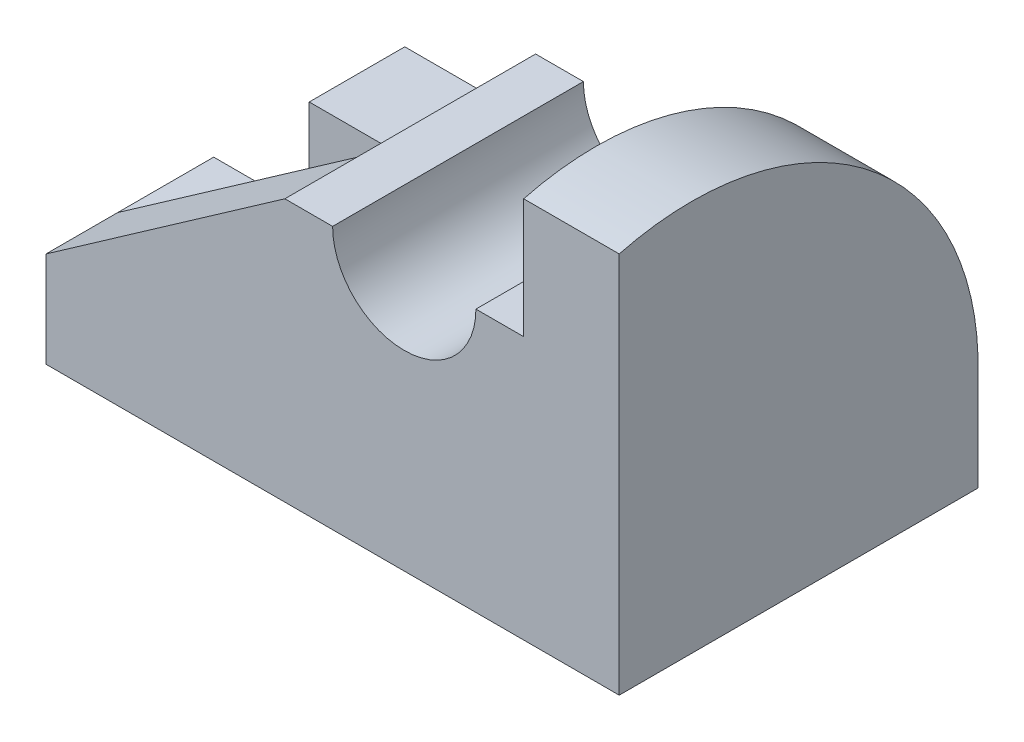
ISO-10303-21;
HEADER;
FILE_DESCRIPTION(('STEP AP214'),'2;1');
FILE_NAME('part.step','',(''),(''),'','','');
FILE_SCHEMA(('AUTOMOTIVE_DESIGN { 1 0 10303 214 1 1 1 1 }'));
ENDSEC;
DATA;
#1=APPLICATION_CONTEXT('core data for automotive mechanical design processes');
#2=APPLICATION_PROTOCOL_DEFINITION('international standard','automotive_design',2000,#1);
#3=PRODUCT_CONTEXT('',#1,'mechanical');
#4=PRODUCT('Part','Part','',(#3));
#5=PRODUCT_RELATED_PRODUCT_CATEGORY('part','',(#4));
#6=PRODUCT_DEFINITION_FORMATION('','',#4);
#7=PRODUCT_DEFINITION_CONTEXT('part definition',#1,'design');
#8=PRODUCT_DEFINITION('design','',#6,#7);
#9=PRODUCT_DEFINITION_SHAPE('','',#8);
#10=(LENGTH_UNIT() NAMED_UNIT(*) SI_UNIT(.MILLI.,.METRE.));
#11=(NAMED_UNIT(*) PLANE_ANGLE_UNIT() SI_UNIT($,.RADIAN.));
#12=(NAMED_UNIT(*) SI_UNIT($,.STERADIAN.) SOLID_ANGLE_UNIT());
#13=UNCERTAINTY_MEASURE_WITH_UNIT(LENGTH_MEASURE(1.E-05),#10,'distance_accuracy_value','');
#14=(GEOMETRIC_REPRESENTATION_CONTEXT(3) GLOBAL_UNCERTAINTY_ASSIGNED_CONTEXT((#13)) GLOBAL_UNIT_ASSIGNED_CONTEXT((#10,
#11,#12)) REPRESENTATION_CONTEXT('',''));
#15=CARTESIAN_POINT('',(0.,0.,0.));
#16=DIRECTION('',(0.,0.,1.));
#17=DIRECTION('',(1.,0.,0.));
#18=AXIS2_PLACEMENT_3D('',#15,#16,#17);
#19=CARTESIAN_POINT('',(-48.,16.,30.0425531914894));
#20=DIRECTION('',(1.,0.,0.));
#21=DIRECTION('',(0.,0.,-1.));
#22=AXIS2_PLACEMENT_3D('',#19,#20,#21);
#23=PLANE('',#22);
#24=DIRECTION('',(0.,1.,0.));
#25=VECTOR('',#24,1.);
#26=CARTESIAN_POINT('',(-48.,0.,-14.0425531914894));
#27=LINE('',#26,#25);
#28=CARTESIAN_POINT('',(-48.,0.,-14.0425531914894));
#29=VERTEX_POINT('',#28);
#30=CARTESIAN_POINT('',(-48.,16.,-14.0425531914894));
#31=VERTEX_POINT('',#30);
#32=EDGE_CURVE('E174',#29,#31,#27,.T.);
#33=ORIENTED_EDGE('',*,*,#32,.T.);
#34=DIRECTION('',(0.,0.,1.));
#35=VECTOR('',#34,1.);
#36=CARTESIAN_POINT('',(-48.,16.,30.0425531914894));
#37=LINE('',#36,#35);
#38=CARTESIAN_POINT('',(-48.,16.,-30.0425531914894));
#39=VERTEX_POINT('',#38);
#40=EDGE_CURVE('E244',#39,#31,#37,.T.);
#41=ORIENTED_EDGE('',*,*,#40,.F.);
#42=DIRECTION('',(0.,-1.,0.));
#43=VECTOR('',#42,1.);
#44=CARTESIAN_POINT('',(-48.,16.,-30.0425531914894));
#45=LINE('',#44,#43);
#46=CARTESIAN_POINT('',(-48.,0.,-30.0425531914894));
#47=VERTEX_POINT('',#46);
#48=EDGE_CURVE('E262',#39,#47,#45,.T.);
#49=ORIENTED_EDGE('',*,*,#48,.T.);
#50=DIRECTION('',(0.,0.,1.));
#51=VECTOR('',#50,1.);
#52=CARTESIAN_POINT('',(-48.,0.,30.0425531914894));
#53=LINE('',#52,#51);
#54=EDGE_CURVE('E252',#47,#29,#53,.T.);
#55=ORIENTED_EDGE('',*,*,#54,.T.);
#56=EDGE_LOOP('',(#33,#41,#49,#55));
#57=FACE_BOUND('',#56,.T.);
#58=ADVANCED_FACE('F33',(#57),#23,.F.);
#59=CARTESIAN_POINT('',(0.,44.,0.));
#60=DIRECTION('',(0.,1.,0.));
#61=DIRECTION('',(0.,0.,1.));
#62=AXIS2_PLACEMENT_3D('',#59,#60,#61);
#63=PLANE('',#62);
#64=DIRECTION('',(0.,0.,1.));
#65=VECTOR('',#64,1.);
#66=CARTESIAN_POINT('',(0.,44.,-12.9574468085106));
#67=LINE('',#66,#65);
#68=CARTESIAN_POINT('',(0.,44.,-11.9574468085106));
#69=VERTEX_POINT('',#68);
#70=CARTESIAN_POINT('',(0.,44.,30.0425531914894));
#71=VERTEX_POINT('',#70);
#72=EDGE_CURVE('E11',#69,#71,#67,.T.);
#73=ORIENTED_EDGE('',*,*,#72,.F.);
#74=DIRECTION('',(-1.,0.,0.));
#75=VECTOR('',#74,1.);
#76=CARTESIAN_POINT('',(32.,44.,-11.9574468085106));
#77=LINE('',#76,#75);
#78=CARTESIAN_POINT('',(-8.,44.,-11.9574468085106));
#79=VERTEX_POINT('',#78);
#80=EDGE_CURVE('E202',#69,#79,#77,.T.);
#81=ORIENTED_EDGE('',*,*,#80,.T.);
#82=DIRECTION('',(0.,0.,1.));
#83=VECTOR('',#82,1.);
#84=CARTESIAN_POINT('',(-8.,44.,30.0425531914894));
#85=LINE('',#84,#83);
#86=CARTESIAN_POINT('',(-8.,44.,18.0425531914894));
#87=VERTEX_POINT('',#86);
#88=EDGE_CURVE('E207',#79,#87,#85,.T.);
#89=ORIENTED_EDGE('',*,*,#88,.T.);
#90=DIRECTION('',(0.,0.,1.));
#91=VECTOR('',#90,1.);
#92=CARTESIAN_POINT('',(-8.,44.,18.0425531914894));
#93=LINE('',#92,#91);
#94=CARTESIAN_POINT('',(-8.,44.,30.0425531914894));
#95=VERTEX_POINT('',#94);
#96=EDGE_CURVE('E187',#87,#95,#93,.T.);
#97=ORIENTED_EDGE('',*,*,#96,.T.);
#98=DIRECTION('',(1.,0.,0.));
#99=VECTOR('',#98,1.);
#100=CARTESIAN_POINT('',(32.,44.,30.0425531914894));
#101=LINE('',#100,#99);
#102=EDGE_CURVE('E211',#95,#71,#101,.T.);
#103=ORIENTED_EDGE('',*,*,#102,.T.);
#104=EDGE_LOOP('',(#73,#81,#89,#97,#103));
#105=FACE_BOUND('',#104,.T.);
#106=ADVANCED_FACE('F295',(#105),#63,.T.);
#107=CARTESIAN_POINT('',(0.,16.,0.));
#108=DIRECTION('',(0.,-1.,0.));
#109=DIRECTION('',(0.,0.,-1.));
#110=AXIS2_PLACEMENT_3D('',#107,#108,#109);
#111=PLANE('',#110);
#112=CARTESIAN_POINT('',(-28.,16.,-6.04255319148937));
#113=DIRECTION('',(0.,1.,0.));
#114=DIRECTION('',(0.,0.,1.));
#115=AXIS2_PLACEMENT_3D('',#112,#113,#114);
#116=CIRCLE('',#115,8.);
#117=CARTESIAN_POINT('',(-28.,16.,1.95744680851063));
#118=VERTEX_POINT('',#117);
#119=CARTESIAN_POINT('',(-28.,16.,-14.0425531914894));
#120=VERTEX_POINT('',#119);
#121=EDGE_CURVE('E165',#118,#120,#116,.T.);
#122=ORIENTED_EDGE('',*,*,#121,.F.);
#123=DIRECTION('',(1.,0.,0.));
#124=VECTOR('',#123,1.);
#125=CARTESIAN_POINT('',(0.,16.,1.95744680851063));
#126=LINE('',#125,#124);
#127=CARTESIAN_POINT('',(-48.,16.,1.95744680851063));
#128=VERTEX_POINT('',#127);
#129=EDGE_CURVE('E148',#128,#118,#126,.T.);
#130=ORIENTED_EDGE('',*,*,#129,.F.);
#131=CARTESIAN_POINT('',(-48.,16.,18.0425531914894));
#132=VERTEX_POINT('',#131);
#133=EDGE_CURVE('E242',#128,#132,#37,.T.);
#134=ORIENTED_EDGE('',*,*,#133,.T.);
#135=DIRECTION('',(1.,0.,0.));
#136=VECTOR('',#135,1.);
#137=CARTESIAN_POINT('',(-48.,16.,18.0425531914894));
#138=LINE('',#137,#136);
#139=CARTESIAN_POINT('',(-8.,16.,18.0425531914894));
#140=VERTEX_POINT('',#139);
#141=EDGE_CURVE('E184',#132,#140,#138,.T.);
#142=ORIENTED_EDGE('',*,*,#141,.T.);
#143=DIRECTION('',(0.,0.,1.));
#144=VECTOR('',#143,1.);
#145=CARTESIAN_POINT('',(-8.,16.,30.0425531914894));
#146=LINE('',#145,#144);
#147=CARTESIAN_POINT('',(-8.,16.,-11.9574468085106));
#148=VERTEX_POINT('',#147);
#149=EDGE_CURVE('E203',#148,#140,#146,.T.);
#150=ORIENTED_EDGE('',*,*,#149,.F.);
#151=DIRECTION('',(-1.,0.,0.));
#152=VECTOR('',#151,1.);
#153=CARTESIAN_POINT('',(32.,16.,-11.9574468085106));
#154=LINE('',#153,#152);
#155=CARTESIAN_POINT('',(32.,16.,-11.9574468085106));
#156=VERTEX_POINT('',#155);
#157=EDGE_CURVE('E198',#156,#148,#154,.T.);
#158=ORIENTED_EDGE('',*,*,#157,.F.);
#159=DIRECTION('',(0.,0.,-1.));
#160=VECTOR('',#159,1.);
#161=CARTESIAN_POINT('',(32.,16.,0.));
#162=LINE('',#161,#160);
#163=CARTESIAN_POINT('',(32.,16.,-30.0425531914894));
#164=VERTEX_POINT('',#163);
#165=EDGE_CURVE('E236',#156,#164,#162,.T.);
#166=ORIENTED_EDGE('',*,*,#165,.T.);
#167=DIRECTION('',(-1.,0.,0.));
#168=VECTOR('',#167,1.);
#169=CARTESIAN_POINT('',(-48.,16.,-30.0425531914894));
#170=LINE('',#169,#168);
#171=EDGE_CURVE('E243',#164,#39,#170,.T.);
#172=ORIENTED_EDGE('',*,*,#171,.T.);
#173=ORIENTED_EDGE('',*,*,#40,.T.);
#174=DIRECTION('',(1.,0.,0.));
#175=VECTOR('',#174,1.);
#176=CARTESIAN_POINT('',(0.,16.,-14.0425531914894));
#177=LINE('',#176,#175);
#178=EDGE_CURVE('E162',#31,#120,#177,.T.);
#179=ORIENTED_EDGE('',*,*,#178,.T.);
#180=EDGE_LOOP('',(#122,#130,#134,#142,#150,#158,#166,#172,#173,#179));
#181=FACE_BOUND('',#180,.T.);
#182=ADVANCED_FACE('F303',(#181),#111,.F.);
#183=CARTESIAN_POINT('',(32.,17.5528005029437,17.9323236775351));
#184=DIRECTION('',(-1.,0.,0.));
#185=DIRECTION('',(0.,0.,1.));
#186=AXIS2_PLACEMENT_3D('',#183,#184,#185);
#187=PLANE('',#186);
#188=ORIENTED_EDGE('',*,*,#165,.F.);
#189=DIRECTION('',(0.,-1.,0.));
#190=VECTOR('',#189,1.);
#191=CARTESIAN_POINT('',(32.,44.,-11.9574468085106));
#192=LINE('',#191,#190);
#193=CARTESIAN_POINT('',(32.,44.,-11.9574468085106));
#194=VERTEX_POINT('',#193);
#195=EDGE_CURVE('E221',#194,#156,#192,.T.);
#196=ORIENTED_EDGE('',*,*,#195,.F.);
#197=DIRECTION('',(0.,0.,-1.));
#198=VECTOR('',#197,1.);
#199=CARTESIAN_POINT('',(32.,44.,30.0425531914894));
#200=LINE('',#199,#198);
#201=CARTESIAN_POINT('',(32.,44.,30.0425531914894));
#202=VERTEX_POINT('',#201);
#203=EDGE_CURVE('E199',#202,#194,#200,.T.);
#204=ORIENTED_EDGE('',*,*,#203,.F.);
#205=DIRECTION('',(0.,-1.,0.));
#206=VECTOR('',#205,1.);
#207=CARTESIAN_POINT('',(32.,16.,30.0425531914894));
#208=LINE('',#207,#206);
#209=CARTESIAN_POINT('',(32.,64.,30.0425531914894));
#210=VERTEX_POINT('',#209);
#211=EDGE_CURVE('E225',#210,#202,#208,.T.);
#212=ORIENTED_EDGE('',*,*,#211,.F.);
#213=CARTESIAN_POINT('',(32.,17.5528005029437,17.9323236775351));
#214=DIRECTION('',(1.,0.,0.));
#215=DIRECTION('',(0.,0.,1.));
#216=AXIS2_PLACEMENT_3D('',#213,#214,#215);
#217=CIRCLE('',#216,48.);
#218=EDGE_CURVE('E228',#164,#210,#217,.T.);
#219=ORIENTED_EDGE('',*,*,#218,.F.);
#220=EDGE_LOOP('',(#188,#196,#204,#212,#219));
#221=FACE_BOUND('',#220,.T.);
#222=ADVANCED_FACE('F280',(#221),#187,.T.);
#223=CARTESIAN_POINT('',(48.,16.,30.0425531914894));
#224=DIRECTION('',(-1.,0.,0.));
#225=DIRECTION('',(0.,0.,1.));
#226=AXIS2_PLACEMENT_3D('',#223,#224,#225);
#227=PLANE('',#226);
#228=DIRECTION('',(0.,0.,-1.));
#229=VECTOR('',#228,1.);
#230=CARTESIAN_POINT('',(48.,0.,30.0425531914894));
#231=LINE('',#230,#229);
#232=CARTESIAN_POINT('',(48.,0.,30.0425531914894));
#233=VERTEX_POINT('',#232);
#234=CARTESIAN_POINT('',(48.,0.,-30.0425531914894));
#235=VERTEX_POINT('',#234);
#236=EDGE_CURVE('E238',#233,#235,#231,.T.);
#237=ORIENTED_EDGE('',*,*,#236,.T.);
#238=DIRECTION('',(0.,-1.,0.));
#239=VECTOR('',#238,1.);
#240=CARTESIAN_POINT('',(48.,16.,-30.0425531914894));
#241=LINE('',#240,#239);
#242=CARTESIAN_POINT('',(48.,16.,-30.0425531914894));
#243=VERTEX_POINT('',#242);
#244=EDGE_CURVE('E265',#243,#235,#241,.T.);
#245=ORIENTED_EDGE('',*,*,#244,.F.);
#246=CARTESIAN_POINT('',(48.,17.5528005029437,17.9323236775351));
#247=DIRECTION('',(1.,0.,0.));
#248=DIRECTION('',(0.,0.,1.));
#249=AXIS2_PLACEMENT_3D('',#246,#247,#248);
#250=CIRCLE('',#249,48.);
#251=CARTESIAN_POINT('',(48.,64.,30.0425531914894));
#252=VERTEX_POINT('',#251);
#253=EDGE_CURVE('E224',#243,#252,#250,.T.);
#254=ORIENTED_EDGE('',*,*,#253,.T.);
#255=DIRECTION('',(0.,-1.,0.));
#256=VECTOR('',#255,1.);
#257=CARTESIAN_POINT('',(48.,16.,30.0425531914894));
#258=LINE('',#257,#256);
#259=EDGE_CURVE('E247',#252,#233,#258,.T.);
#260=ORIENTED_EDGE('',*,*,#259,.T.);
#261=EDGE_LOOP('',(#237,#245,#254,#260));
#262=FACE_BOUND('',#261,.T.);
#263=ADVANCED_FACE('F35',(#262),#227,.F.);
#264=CARTESIAN_POINT('',(-48.,16.,-30.0425531914894));
#265=DIRECTION('',(0.,0.,1.));
#266=DIRECTION('',(1.,0.,0.));
#267=AXIS2_PLACEMENT_3D('',#264,#265,#266);
#268=PLANE('',#267);
#269=ORIENTED_EDGE('',*,*,#171,.F.);
#270=EDGE_CURVE('E239',#243,#164,#170,.T.);
#271=ORIENTED_EDGE('',*,*,#270,.F.);
#272=ORIENTED_EDGE('',*,*,#244,.T.);
#273=DIRECTION('',(-1.,0.,0.));
#274=VECTOR('',#273,1.);
#275=CARTESIAN_POINT('',(-48.,0.,-30.0425531914894));
#276=LINE('',#275,#274);
#277=EDGE_CURVE('E250',#235,#47,#276,.T.);
#278=ORIENTED_EDGE('',*,*,#277,.T.);
#279=ORIENTED_EDGE('',*,*,#48,.F.);
#280=EDGE_LOOP('',(#269,#271,#272,#278,#279));
#281=FACE_BOUND('',#280,.T.);
#282=ADVANCED_FACE('F312',(#281),#268,.F.);
#283=ORIENTED_EDGE('',*,*,#133,.F.);
#284=DIRECTION('',(0.,1.,0.));
#285=VECTOR('',#284,1.);
#286=CARTESIAN_POINT('',(-48.,0.,1.95744680851063));
#287=LINE('',#286,#285);
#288=CARTESIAN_POINT('',(-48.,0.,1.95744680851063));
#289=VERTEX_POINT('',#288);
#290=EDGE_CURVE('E171',#289,#128,#287,.T.);
#291=ORIENTED_EDGE('',*,*,#290,.F.);
#292=CARTESIAN_POINT('',(-48.,0.,30.0425531914894));
#293=VERTEX_POINT('',#292);
#294=EDGE_CURVE('E161',#289,#293,#53,.T.);
#295=ORIENTED_EDGE('',*,*,#294,.T.);
#296=DIRECTION('',(0.,-1.,0.));
#297=VECTOR('',#296,1.);
#298=CARTESIAN_POINT('',(-48.,16.,30.0425531914894));
#299=LINE('',#298,#297);
#300=CARTESIAN_POINT('',(-48.,16.,30.0425531914894));
#301=VERTEX_POINT('',#300);
#302=EDGE_CURVE('E259',#301,#293,#299,.T.);
#303=ORIENTED_EDGE('',*,*,#302,.F.);
#304=DIRECTION('',(0.,0.,1.));
#305=VECTOR('',#304,1.);
#306=CARTESIAN_POINT('',(-48.,16.,18.0425531914894));
#307=LINE('',#306,#305);
#308=EDGE_CURVE('E190',#132,#301,#307,.T.);
#309=ORIENTED_EDGE('',*,*,#308,.F.);
#310=EDGE_LOOP('',(#283,#291,#295,#303,#309));
#311=FACE_BOUND('',#310,.T.);
#312=ADVANCED_FACE('F302',(#311),#23,.F.);
#313=CARTESIAN_POINT('',(-48.,16.,30.0425531914894));
#314=DIRECTION('',(0.,0.,-1.));
#315=DIRECTION('',(-1.,0.,0.));
#316=AXIS2_PLACEMENT_3D('',#313,#314,#315);
#317=PLANE('',#316);
#318=CARTESIAN_POINT('',(24.,44.,30.0425531914894));
#319=VERTEX_POINT('',#318);
#320=EDGE_CURVE('E210',#319,#202,#101,.T.);
#321=ORIENTED_EDGE('',*,*,#320,.F.);
#322=CARTESIAN_POINT('',(12.,44.,30.0425531914894));
#323=DIRECTION('',(0.,0.,1.));
#324=DIRECTION('',(1.,0.,0.));
#325=AXIS2_PLACEMENT_3D('',#322,#323,#324);
#326=CIRCLE('',#325,12.);
#327=EDGE_CURVE('E55',#71,#319,#326,.T.);
#328=ORIENTED_EDGE('',*,*,#327,.F.);
#329=ORIENTED_EDGE('',*,*,#102,.F.);
#330=DIRECTION('',(-0.819231920519041,-0.573462344363328,0.));
#331=VECTOR('',#330,1.);
#332=CARTESIAN_POINT('',(-8.,44.,30.0425531914894));
#333=LINE('',#332,#331);
#334=EDGE_CURVE('E173',#95,#301,#333,.T.);
#335=ORIENTED_EDGE('',*,*,#334,.T.);
#336=ORIENTED_EDGE('',*,*,#302,.T.);
#337=DIRECTION('',(1.,0.,0.));
#338=VECTOR('',#337,1.);
#339=CARTESIAN_POINT('',(-48.,0.,30.0425531914894));
#340=LINE('',#339,#338);
#341=EDGE_CURVE('E255',#293,#233,#340,.T.);
#342=ORIENTED_EDGE('',*,*,#341,.T.);
#343=ORIENTED_EDGE('',*,*,#259,.F.);
#344=DIRECTION('',(1.,0.,0.));
#345=VECTOR('',#344,1.);
#346=CARTESIAN_POINT('',(32.,64.,30.0425531914894));
#347=LINE('',#346,#345);
#348=EDGE_CURVE('E231',#210,#252,#347,.T.);
#349=ORIENTED_EDGE('',*,*,#348,.F.);
#350=ORIENTED_EDGE('',*,*,#211,.T.);
#351=EDGE_LOOP('',(#321,#328,#329,#335,#336,#342,#343,#349,#350));
#352=FACE_BOUND('',#351,.T.);
#353=ADVANCED_FACE('F284',(#352),#317,.F.);
#354=CARTESIAN_POINT('',(0.,0.,0.));
#355=DIRECTION('',(0.,-1.,0.));
#356=DIRECTION('',(0.,0.,-1.));
#357=AXIS2_PLACEMENT_3D('',#354,#355,#356);
#358=PLANE('',#357);
#359=DIRECTION('',(1.,0.,0.));
#360=VECTOR('',#359,1.);
#361=CARTESIAN_POINT('',(0.,0.,1.95744680851063));
#362=LINE('',#361,#360);
#363=CARTESIAN_POINT('',(-28.,0.,1.95744680851063));
#364=VERTEX_POINT('',#363);
#365=EDGE_CURVE('E145',#289,#364,#362,.T.);
#366=ORIENTED_EDGE('',*,*,#365,.T.);
#367=CARTESIAN_POINT('',(-28.,0.,-6.04255319148937));
#368=DIRECTION('',(0.,1.,0.));
#369=DIRECTION('',(0.,0.,1.));
#370=AXIS2_PLACEMENT_3D('',#367,#368,#369);
#371=CIRCLE('',#370,8.);
#372=CARTESIAN_POINT('',(-28.,0.,-14.0425531914894));
#373=VERTEX_POINT('',#372);
#374=EDGE_CURVE('E153',#364,#373,#371,.T.);
#375=ORIENTED_EDGE('',*,*,#374,.T.);
#376=DIRECTION('',(1.,0.,0.));
#377=VECTOR('',#376,1.);
#378=CARTESIAN_POINT('',(0.,0.,-14.0425531914894));
#379=LINE('',#378,#377);
#380=EDGE_CURVE('E150',#29,#373,#379,.T.);
#381=ORIENTED_EDGE('',*,*,#380,.F.);
#382=ORIENTED_EDGE('',*,*,#54,.F.);
#383=ORIENTED_EDGE('',*,*,#277,.F.);
#384=ORIENTED_EDGE('',*,*,#236,.F.);
#385=ORIENTED_EDGE('',*,*,#341,.F.);
#386=ORIENTED_EDGE('',*,*,#294,.F.);
#387=EDGE_LOOP('',(#366,#375,#381,#382,#383,#384,#385,#386));
#388=FACE_BOUND('',#387,.T.);
#389=ADVANCED_FACE('F159',(#388),#358,.T.);
#390=CARTESIAN_POINT('',(32.,17.5528005029437,17.9323236775351));
#391=DIRECTION('',(1.,0.,0.));
#392=DIRECTION('',(0.,0.,-1.));
#393=AXIS2_PLACEMENT_3D('',#390,#391,#392);
#394=CYLINDRICAL_SURFACE('',#393,48.);
#395=ORIENTED_EDGE('',*,*,#253,.F.);
#396=ORIENTED_EDGE('',*,*,#270,.T.);
#397=ORIENTED_EDGE('',*,*,#218,.T.);
#398=ORIENTED_EDGE('',*,*,#348,.T.);
#399=EDGE_LOOP('',(#395,#396,#397,#398));
#400=FACE_BOUND('',#399,.T.);
#401=ADVANCED_FACE('F287',(#400),#394,.T.);
#402=CARTESIAN_POINT('',(32.,44.,-11.9574468085106));
#403=DIRECTION('',(0.,0.,1.));
#404=DIRECTION('',(1.,0.,0.));
#405=AXIS2_PLACEMENT_3D('',#402,#403,#404);
#406=PLANE('',#405);
#407=ORIENTED_EDGE('',*,*,#80,.F.);
#408=CARTESIAN_POINT('',(12.,44.,-11.9574468085106));
#409=DIRECTION('',(0.,0.,1.));
#410=DIRECTION('',(1.,0.,0.));
#411=AXIS2_PLACEMENT_3D('',#408,#409,#410);
#412=CIRCLE('',#411,12.);
#413=CARTESIAN_POINT('',(24.,44.,-11.9574468085106));
#414=VERTEX_POINT('',#413);
#415=EDGE_CURVE('E195',#69,#414,#412,.T.);
#416=ORIENTED_EDGE('',*,*,#415,.T.);
#417=EDGE_CURVE('E204',#194,#414,#77,.T.);
#418=ORIENTED_EDGE('',*,*,#417,.F.);
#419=ORIENTED_EDGE('',*,*,#195,.T.);
#420=ORIENTED_EDGE('',*,*,#157,.T.);
#421=DIRECTION('',(0.,-1.,0.));
#422=VECTOR('',#421,1.);
#423=CARTESIAN_POINT('',(-8.,44.,-11.9574468085106));
#424=LINE('',#423,#422);
#425=EDGE_CURVE('E214',#79,#148,#424,.T.);
#426=ORIENTED_EDGE('',*,*,#425,.F.);
#427=EDGE_LOOP('',(#407,#416,#418,#419,#420,#426));
#428=FACE_BOUND('',#427,.T.);
#429=ADVANCED_FACE('F274',(#428),#406,.F.);
#430=CARTESIAN_POINT('',(-8.,44.,30.0425531914894));
#431=DIRECTION('',(1.,0.,0.));
#432=DIRECTION('',(0.,0.,-1.));
#433=AXIS2_PLACEMENT_3D('',#430,#431,#432);
#434=PLANE('',#433);
#435=ORIENTED_EDGE('',*,*,#149,.T.);
#436=DIRECTION('',(0.,1.,0.));
#437=VECTOR('',#436,1.);
#438=CARTESIAN_POINT('',(-8.,16.,18.0425531914894));
#439=LINE('',#438,#437);
#440=EDGE_CURVE('E178',#140,#87,#439,.T.);
#441=ORIENTED_EDGE('',*,*,#440,.T.);
#442=ORIENTED_EDGE('',*,*,#88,.F.);
#443=ORIENTED_EDGE('',*,*,#425,.T.);
#444=EDGE_LOOP('',(#435,#441,#442,#443));
#445=FACE_BOUND('',#444,.T.);
#446=ADVANCED_FACE('F293',(#445),#434,.F.);
#447=DIRECTION('',(0.,0.,1.));
#448=VECTOR('',#447,1.);
#449=CARTESIAN_POINT('',(24.,44.,-12.9574468085106));
#450=LINE('',#449,#448);
#451=EDGE_CURVE('E41',#319,#414,#450,.F.);
#452=ORIENTED_EDGE('',*,*,#451,.F.);
#453=ORIENTED_EDGE('',*,*,#320,.T.);
#454=ORIENTED_EDGE('',*,*,#203,.T.);
#455=ORIENTED_EDGE('',*,*,#417,.T.);
#456=EDGE_LOOP('',(#452,#453,#454,#455));
#457=FACE_BOUND('',#456,.T.);
#458=ADVANCED_FACE('F276',(#457),#63,.T.);
#459=CARTESIAN_POINT('',(12.,44.,-12.9574468085106));
#460=DIRECTION('',(0.,0.,1.));
#461=DIRECTION('',(1.,0.,0.));
#462=AXIS2_PLACEMENT_3D('',#459,#460,#461);
#463=CYLINDRICAL_SURFACE('',#462,12.);
#464=ORIENTED_EDGE('',*,*,#72,.T.);
#465=ORIENTED_EDGE('',*,*,#327,.T.);
#466=ORIENTED_EDGE('',*,*,#451,.T.);
#467=ORIENTED_EDGE('',*,*,#415,.F.);
#468=EDGE_LOOP('',(#464,#465,#466,#467));
#469=FACE_BOUND('',#468,.T.);
#470=ADVANCED_FACE('F267',(#469),#463,.F.);
#471=CARTESIAN_POINT('',(-8.,44.,18.0425531914894));
#472=DIRECTION('',(-0.573462344363328,0.81923192051904,0.));
#473=DIRECTION('',(-0.819231920519041,-0.573462344363328,0.));
#474=AXIS2_PLACEMENT_3D('',#471,#472,#473);
#475=PLANE('',#474);
#476=ORIENTED_EDGE('',*,*,#334,.F.);
#477=ORIENTED_EDGE('',*,*,#96,.F.);
#478=DIRECTION('',(-0.819231920519041,-0.573462344363328,0.));
#479=VECTOR('',#478,1.);
#480=CARTESIAN_POINT('',(-8.,44.,18.0425531914894));
#481=LINE('',#480,#479);
#482=EDGE_CURVE('E181',#87,#132,#481,.T.);
#483=ORIENTED_EDGE('',*,*,#482,.T.);
#484=ORIENTED_EDGE('',*,*,#308,.T.);
#485=EDGE_LOOP('',(#476,#477,#483,#484));
#486=FACE_BOUND('',#485,.T.);
#487=ADVANCED_FACE('F347',(#486),#475,.T.);
#488=CARTESIAN_POINT('',(0.,0.,18.0425531914894));
#489=DIRECTION('',(0.,0.,-1.));
#490=DIRECTION('',(-1.,0.,0.));
#491=AXIS2_PLACEMENT_3D('',#488,#489,#490);
#492=PLANE('',#491);
#493=ORIENTED_EDGE('',*,*,#440,.F.);
#494=ORIENTED_EDGE('',*,*,#141,.F.);
#495=ORIENTED_EDGE('',*,*,#482,.F.);
#496=EDGE_LOOP('',(#493,#494,#495));
#497=FACE_BOUND('',#496,.T.);
#498=ADVANCED_FACE('F350',(#497),#492,.T.);
#499=CARTESIAN_POINT('',(0.,0.,1.95744680851063));
#500=DIRECTION('',(0.,0.,1.));
#501=DIRECTION('',(1.,0.,0.));
#502=AXIS2_PLACEMENT_3D('',#499,#500,#501);
#503=PLANE('',#502);
#504=ORIENTED_EDGE('',*,*,#129,.T.);
#505=DIRECTION('',(0.,1.,0.));
#506=VECTOR('',#505,1.);
#507=CARTESIAN_POINT('',(-28.,0.,1.95744680851063));
#508=LINE('',#507,#506);
#509=EDGE_CURVE('E142',#364,#118,#508,.T.);
#510=ORIENTED_EDGE('',*,*,#509,.F.);
#511=ORIENTED_EDGE('',*,*,#365,.F.);
#512=ORIENTED_EDGE('',*,*,#290,.T.);
#513=EDGE_LOOP('',(#504,#510,#511,#512));
#514=FACE_BOUND('',#513,.T.);
#515=ADVANCED_FACE('F143',(#514),#503,.F.);
#516=CARTESIAN_POINT('',(0.,0.,-14.0425531914894));
#517=DIRECTION('',(0.,0.,1.));
#518=DIRECTION('',(1.,0.,0.));
#519=AXIS2_PLACEMENT_3D('',#516,#517,#518);
#520=PLANE('',#519);
#521=ORIENTED_EDGE('',*,*,#178,.F.);
#522=ORIENTED_EDGE('',*,*,#32,.F.);
#523=ORIENTED_EDGE('',*,*,#380,.T.);
#524=DIRECTION('',(0.,1.,0.));
#525=VECTOR('',#524,1.);
#526=CARTESIAN_POINT('',(-28.,0.,-14.0425531914894));
#527=LINE('',#526,#525);
#528=EDGE_CURVE('E48',#373,#120,#527,.T.);
#529=ORIENTED_EDGE('',*,*,#528,.T.);
#530=EDGE_LOOP('',(#521,#522,#523,#529));
#531=FACE_BOUND('',#530,.T.);
#532=ADVANCED_FACE('F306',(#531),#520,.T.);
#533=CARTESIAN_POINT('',(-28.,0.,-6.04255319148937));
#534=DIRECTION('',(0.,1.,0.));
#535=DIRECTION('',(0.,0.,1.));
#536=AXIS2_PLACEMENT_3D('',#533,#534,#535);
#537=CYLINDRICAL_SURFACE('',#536,8.);
#538=ORIENTED_EDGE('',*,*,#121,.T.);
#539=ORIENTED_EDGE('',*,*,#528,.F.);
#540=ORIENTED_EDGE('',*,*,#374,.F.);
#541=ORIENTED_EDGE('',*,*,#509,.T.);
#542=EDGE_LOOP('',(#538,#539,#540,#541));
#543=FACE_BOUND('',#542,.T.);
#544=ADVANCED_FACE('F154',(#543),#537,.F.);
#545=CLOSED_SHELL('',(#58,#106,#182,#222,#263,#282,#312,#353,#389,#401,#429,#446,#458,#470,#487,
#498,#515,#532,#544));
#546=MANIFOLD_SOLID_BREP('B2',#545);
#547=ADVANCED_BREP_SHAPE_REPRESENTATION('',(#18,#546),#14);
#548=SHAPE_DEFINITION_REPRESENTATION(#9,#547);
ENDSEC;
END-ISO-10303-21;
